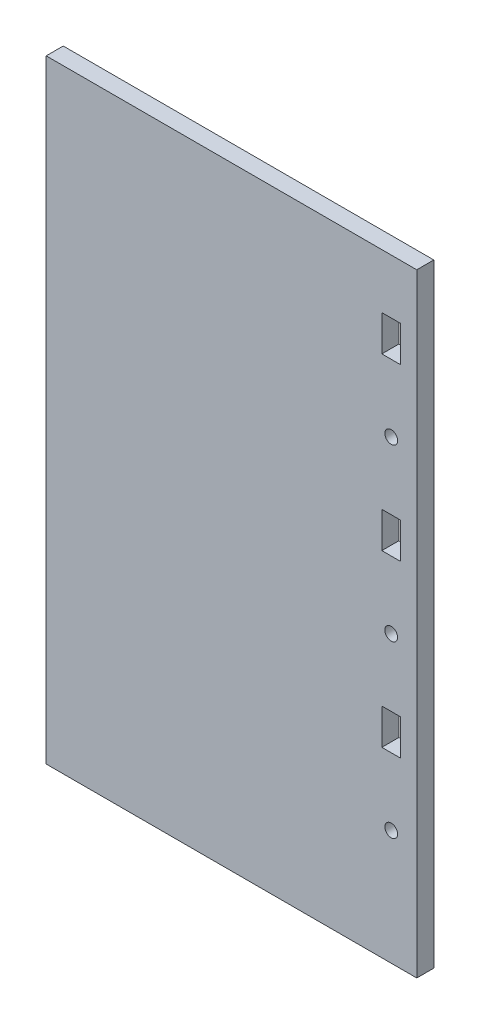
ISO-10303-21;
HEADER;
FILE_DESCRIPTION(('STEP AP214'),'2;1');
FILE_NAME('part.step','',(''),(''),'','','');
FILE_SCHEMA(('AUTOMOTIVE_DESIGN { 1 0 10303 214 1 1 1 1 }'));
ENDSEC;
DATA;
#1=APPLICATION_CONTEXT('core data for automotive mechanical design processes');
#2=APPLICATION_PROTOCOL_DEFINITION('international standard','automotive_design',2000,#1);
#3=PRODUCT_CONTEXT('',#1,'mechanical');
#4=PRODUCT('Part','Part','',(#3));
#5=PRODUCT_RELATED_PRODUCT_CATEGORY('part','',(#4));
#6=PRODUCT_DEFINITION_FORMATION('','',#4);
#7=PRODUCT_DEFINITION_CONTEXT('part definition',#1,'design');
#8=PRODUCT_DEFINITION('design','',#6,#7);
#9=PRODUCT_DEFINITION_SHAPE('','',#8);
#10=(LENGTH_UNIT() NAMED_UNIT(*) SI_UNIT(.MILLI.,.METRE.));
#11=(NAMED_UNIT(*) PLANE_ANGLE_UNIT() SI_UNIT($,.RADIAN.));
#12=(NAMED_UNIT(*) SI_UNIT($,.STERADIAN.) SOLID_ANGLE_UNIT());
#13=UNCERTAINTY_MEASURE_WITH_UNIT(LENGTH_MEASURE(1.E-05),#10,'distance_accuracy_value','');
#14=(GEOMETRIC_REPRESENTATION_CONTEXT(3) GLOBAL_UNCERTAINTY_ASSIGNED_CONTEXT((#13)) GLOBAL_UNIT_ASSIGNED_CONTEXT((#10,
#11,#12)) REPRESENTATION_CONTEXT('',''));
#15=CARTESIAN_POINT('',(0.,0.,0.));
#16=DIRECTION('',(0.,0.,1.));
#17=DIRECTION('',(1.,0.,0.));
#18=AXIS2_PLACEMENT_3D('',#15,#16,#17);
#19=CARTESIAN_POINT('',(0.,0.,4.));
#20=DIRECTION('',(0.,0.,-1.));
#21=DIRECTION('',(-1.,0.,0.));
#22=AXIS2_PLACEMENT_3D('',#19,#20,#21);
#23=PLANE('',#22);
#24=DIRECTION('',(1.,0.,0.));
#25=VECTOR('',#24,1.);
#26=CARTESIAN_POINT('',(35.3,-91.2,4.));
#27=LINE('',#26,#25);
#28=CARTESIAN_POINT('',(35.3,-91.2,4.));
#29=VERTEX_POINT('',#28);
#30=CARTESIAN_POINT('',(39.7,-91.2,4.));
#31=VERTEX_POINT('',#30);
#32=EDGE_CURVE('E237',#29,#31,#27,.T.);
#33=ORIENTED_EDGE('',*,*,#32,.F.);
#34=DIRECTION('',(0.,-1.,0.));
#35=VECTOR('',#34,1.);
#36=CARTESIAN_POINT('',(35.3,-91.2,4.));
#37=LINE('',#36,#35);
#38=CARTESIAN_POINT('',(35.3,-82.8,4.));
#39=VERTEX_POINT('',#38);
#40=EDGE_CURVE('E248',#39,#29,#37,.T.);
#41=ORIENTED_EDGE('',*,*,#40,.F.);
#42=DIRECTION('',(-1.,0.,0.));
#43=VECTOR('',#42,1.);
#44=CARTESIAN_POINT('',(35.3,-82.8,4.));
#45=LINE('',#44,#43);
#46=CARTESIAN_POINT('',(39.7,-82.8,4.));
#47=VERTEX_POINT('',#46);
#48=EDGE_CURVE('E244',#47,#39,#45,.T.);
#49=ORIENTED_EDGE('',*,*,#48,.F.);
#50=DIRECTION('',(0.,1.,0.));
#51=VECTOR('',#50,1.);
#52=CARTESIAN_POINT('',(39.7,-91.2,4.));
#53=LINE('',#52,#51);
#54=EDGE_CURVE('E240',#31,#47,#53,.T.);
#55=ORIENTED_EDGE('',*,*,#54,.F.);
#56=EDGE_LOOP('',(#33,#41,#49,#55));
#57=FACE_BOUND('',#56,.T.);
#58=CARTESIAN_POINT('',(37.5,-147.,4.));
#59=DIRECTION('',(0.,0.,1.));
#60=DIRECTION('',(1.,0.,0.));
#61=AXIS2_PLACEMENT_3D('',#58,#59,#60);
#62=CIRCLE('',#61,1.50000000000002);
#63=CARTESIAN_POINT('',(39.,-147.,4.));
#64=VERTEX_POINT('',#63);
#65=EDGE_CURVE('E331',#64,#64,#62,.T.);
#66=ORIENTED_EDGE('',*,*,#65,.F.);
#67=EDGE_LOOP('',(#66));
#68=FACE_BOUND('',#67,.T.);
#69=DIRECTION('',(0.,1.,0.));
#70=VECTOR('',#69,1.);
#71=CARTESIAN_POINT('',(43.5,-154.,4.));
#72=LINE('',#71,#70);
#73=CARTESIAN_POINT('',(43.5,-174.,4.));
#74=VERTEX_POINT('',#73);
#75=CARTESIAN_POINT('',(43.5,-30.,4.));
#76=VERTEX_POINT('',#75);
#77=EDGE_CURVE('E167',#74,#76,#72,.T.);
#78=ORIENTED_EDGE('',*,*,#77,.T.);
#79=DIRECTION('',(-1.,0.,0.));
#80=VECTOR('',#79,1.);
#81=CARTESIAN_POINT('',(-43.5,-30.,4.));
#82=LINE('',#81,#80);
#83=CARTESIAN_POINT('',(-43.5,-30.,4.));
#84=VERTEX_POINT('',#83);
#85=EDGE_CURVE('E340',#76,#84,#82,.T.);
#86=ORIENTED_EDGE('',*,*,#85,.T.);
#87=DIRECTION('',(0.,-1.,0.));
#88=VECTOR('',#87,1.);
#89=CARTESIAN_POINT('',(-43.5,-50.,4.));
#90=LINE('',#89,#88);
#91=CARTESIAN_POINT('',(-43.5,-174.,4.));
#92=VERTEX_POINT('',#91);
#93=EDGE_CURVE('E343',#84,#92,#90,.T.);
#94=ORIENTED_EDGE('',*,*,#93,.T.);
#95=DIRECTION('',(1.,0.,0.));
#96=VECTOR('',#95,1.);
#97=CARTESIAN_POINT('',(-43.5,-174.,4.));
#98=LINE('',#97,#96);
#99=EDGE_CURVE('E176',#92,#74,#98,.T.);
#100=ORIENTED_EDGE('',*,*,#99,.T.);
#101=EDGE_LOOP('',(#78,#86,#94,#100));
#102=FACE_BOUND('',#101,.T.);
#103=DIRECTION('',(0.,1.,0.));
#104=VECTOR('',#103,1.);
#105=CARTESIAN_POINT('',(39.7,-122.8,4.));
#106=LINE('',#105,#104);
#107=CARTESIAN_POINT('',(39.7,-131.2,4.));
#108=VERTEX_POINT('',#107);
#109=CARTESIAN_POINT('',(39.7,-122.8,4.));
#110=VERTEX_POINT('',#109);
#111=EDGE_CURVE('E288',#108,#110,#106,.T.);
#112=ORIENTED_EDGE('',*,*,#111,.F.);
#113=DIRECTION('',(1.,0.,0.));
#114=VECTOR('',#113,1.);
#115=CARTESIAN_POINT('',(35.3,-131.2,4.));
#116=LINE('',#115,#114);
#117=CARTESIAN_POINT('',(35.3,-131.2,4.));
#118=VERTEX_POINT('',#117);
#119=EDGE_CURVE('E299',#118,#108,#116,.T.);
#120=ORIENTED_EDGE('',*,*,#119,.F.);
#121=DIRECTION('',(0.,-1.,0.));
#122=VECTOR('',#121,1.);
#123=CARTESIAN_POINT('',(35.3,-122.8,4.));
#124=LINE('',#123,#122);
#125=CARTESIAN_POINT('',(35.3,-122.8,4.));
#126=VERTEX_POINT('',#125);
#127=EDGE_CURVE('E295',#126,#118,#124,.T.);
#128=ORIENTED_EDGE('',*,*,#127,.F.);
#129=DIRECTION('',(-1.,0.,0.));
#130=VECTOR('',#129,1.);
#131=CARTESIAN_POINT('',(35.3,-122.8,4.));
#132=LINE('',#131,#130);
#133=EDGE_CURVE('E291',#110,#126,#132,.T.);
#134=ORIENTED_EDGE('',*,*,#133,.F.);
#135=EDGE_LOOP('',(#112,#120,#128,#134));
#136=FACE_BOUND('',#135,.T.);
#137=CARTESIAN_POINT('',(37.5,-67.,4.));
#138=DIRECTION('',(0.,0.,1.));
#139=DIRECTION('',(1.,0.,0.));
#140=AXIS2_PLACEMENT_3D('',#137,#138,#139);
#141=CIRCLE('',#140,1.50000000000002);
#142=CARTESIAN_POINT('',(39.,-67.,4.));
#143=VERTEX_POINT('',#142);
#144=EDGE_CURVE('E280',#143,#143,#141,.T.);
#145=ORIENTED_EDGE('',*,*,#144,.F.);
#146=EDGE_LOOP('',(#145));
#147=FACE_BOUND('',#146,.T.);
#148=DIRECTION('',(0.,-1.,0.));
#149=VECTOR('',#148,1.);
#150=CARTESIAN_POINT('',(35.3,-42.8,4.));
#151=LINE('',#150,#149);
#152=CARTESIAN_POINT('',(35.3,-42.8,4.));
#153=VERTEX_POINT('',#152);
#154=CARTESIAN_POINT('',(35.3,-51.2,4.));
#155=VERTEX_POINT('',#154);
#156=EDGE_CURVE('E199',#153,#155,#151,.T.);
#157=ORIENTED_EDGE('',*,*,#156,.F.);
#158=DIRECTION('',(-1.,0.,0.));
#159=VECTOR('',#158,1.);
#160=CARTESIAN_POINT('',(35.3,-42.8,4.));
#161=LINE('',#160,#159);
#162=CARTESIAN_POINT('',(39.7,-42.8,4.));
#163=VERTEX_POINT('',#162);
#164=EDGE_CURVE('E209',#163,#153,#161,.T.);
#165=ORIENTED_EDGE('',*,*,#164,.F.);
#166=DIRECTION('',(0.,1.,0.));
#167=VECTOR('',#166,1.);
#168=CARTESIAN_POINT('',(39.7,-42.8,4.));
#169=LINE('',#168,#167);
#170=CARTESIAN_POINT('',(39.7,-51.1999999999999,4.));
#171=VERTEX_POINT('',#170);
#172=EDGE_CURVE('E206',#171,#163,#169,.T.);
#173=ORIENTED_EDGE('',*,*,#172,.F.);
#174=DIRECTION('',(1.,0.,0.));
#175=VECTOR('',#174,1.);
#176=CARTESIAN_POINT('',(35.3,-51.2,4.));
#177=LINE('',#176,#175);
#178=EDGE_CURVE('E202',#155,#171,#177,.T.);
#179=ORIENTED_EDGE('',*,*,#178,.F.);
#180=EDGE_LOOP('',(#157,#165,#173,#179));
#181=FACE_BOUND('',#180,.T.);
#182=CARTESIAN_POINT('',(37.5,-107.,4.));
#183=DIRECTION('',(0.,0.,1.));
#184=DIRECTION('',(1.,0.,0.));
#185=AXIS2_PLACEMENT_3D('',#182,#183,#184);
#186=CIRCLE('',#185,1.5);
#187=CARTESIAN_POINT('',(39.,-107.,4.));
#188=VERTEX_POINT('',#187);
#189=EDGE_CURVE('E192',#188,#188,#186,.T.);
#190=ORIENTED_EDGE('',*,*,#189,.F.);
#191=EDGE_LOOP('',(#190));
#192=FACE_BOUND('',#191,.T.);
#193=ADVANCED_FACE('F39',(#57,#68,#102,#136,#147,#181,#192),#23,.F.);
#194=CARTESIAN_POINT('',(0.,0.,0.));
#195=DIRECTION('',(0.,0.,-1.));
#196=DIRECTION('',(-1.,0.,0.));
#197=AXIS2_PLACEMENT_3D('',#194,#195,#196);
#198=PLANE('',#197);
#199=DIRECTION('',(-1.,0.,0.));
#200=VECTOR('',#199,1.);
#201=CARTESIAN_POINT('',(35.3,-42.8,0.));
#202=LINE('',#201,#200);
#203=CARTESIAN_POINT('',(39.7,-42.8,0.));
#204=VERTEX_POINT('',#203);
#205=CARTESIAN_POINT('',(35.3,-42.8,0.));
#206=VERTEX_POINT('',#205);
#207=EDGE_CURVE('E203',#204,#206,#202,.T.);
#208=ORIENTED_EDGE('',*,*,#207,.T.);
#209=DIRECTION('',(0.,-1.,0.));
#210=VECTOR('',#209,1.);
#211=CARTESIAN_POINT('',(35.3,-42.8,0.));
#212=LINE('',#211,#210);
#213=CARTESIAN_POINT('',(35.3,-51.2,0.));
#214=VERTEX_POINT('',#213);
#215=EDGE_CURVE('E63',#206,#214,#212,.T.);
#216=ORIENTED_EDGE('',*,*,#215,.T.);
#217=DIRECTION('',(1.,0.,0.));
#218=VECTOR('',#217,1.);
#219=CARTESIAN_POINT('',(35.3,-51.2,0.));
#220=LINE('',#219,#218);
#221=CARTESIAN_POINT('',(39.7,-51.1999999999999,0.));
#222=VERTEX_POINT('',#221);
#223=EDGE_CURVE('E215',#214,#222,#220,.T.);
#224=ORIENTED_EDGE('',*,*,#223,.T.);
#225=DIRECTION('',(0.,1.,0.));
#226=VECTOR('',#225,1.);
#227=CARTESIAN_POINT('',(39.7,-42.8,0.));
#228=LINE('',#227,#226);
#229=EDGE_CURVE('E219',#222,#204,#228,.T.);
#230=ORIENTED_EDGE('',*,*,#229,.T.);
#231=EDGE_LOOP('',(#208,#216,#224,#230));
#232=FACE_BOUND('',#231,.T.);
#233=DIRECTION('',(0.,-1.,0.));
#234=VECTOR('',#233,1.);
#235=CARTESIAN_POINT('',(35.3,-91.2,0.));
#236=LINE('',#235,#234);
#237=CARTESIAN_POINT('',(35.3,-82.8,0.));
#238=VERTEX_POINT('',#237);
#239=CARTESIAN_POINT('',(35.3,-91.2,0.));
#240=VERTEX_POINT('',#239);
#241=EDGE_CURVE('E241',#238,#240,#236,.T.);
#242=ORIENTED_EDGE('',*,*,#241,.T.);
#243=DIRECTION('',(1.,0.,0.));
#244=VECTOR('',#243,1.);
#245=CARTESIAN_POINT('',(35.3,-91.2,0.));
#246=LINE('',#245,#244);
#247=CARTESIAN_POINT('',(39.7,-91.2,0.));
#248=VERTEX_POINT('',#247);
#249=EDGE_CURVE('E236',#240,#248,#246,.T.);
#250=ORIENTED_EDGE('',*,*,#249,.T.);
#251=DIRECTION('',(0.,1.,0.));
#252=VECTOR('',#251,1.);
#253=CARTESIAN_POINT('',(39.7,-91.2,0.));
#254=LINE('',#253,#252);
#255=CARTESIAN_POINT('',(39.7,-82.8,0.));
#256=VERTEX_POINT('',#255);
#257=EDGE_CURVE('E255',#248,#256,#254,.T.);
#258=ORIENTED_EDGE('',*,*,#257,.T.);
#259=DIRECTION('',(-1.,0.,0.));
#260=VECTOR('',#259,1.);
#261=CARTESIAN_POINT('',(35.3,-82.8,0.));
#262=LINE('',#261,#260);
#263=EDGE_CURVE('E259',#256,#238,#262,.T.);
#264=ORIENTED_EDGE('',*,*,#263,.T.);
#265=EDGE_LOOP('',(#242,#250,#258,#264));
#266=FACE_BOUND('',#265,.T.);
#267=CARTESIAN_POINT('',(37.5,-67.,0.));
#268=DIRECTION('',(0.,0.,1.));
#269=DIRECTION('',(1.,0.,0.));
#270=AXIS2_PLACEMENT_3D('',#267,#268,#269);
#271=CIRCLE('',#270,1.50000000000002);
#272=CARTESIAN_POINT('',(39.,-67.,0.));
#273=VERTEX_POINT('',#272);
#274=EDGE_CURVE('E279',#273,#273,#271,.T.);
#275=ORIENTED_EDGE('',*,*,#274,.T.);
#276=EDGE_LOOP('',(#275));
#277=FACE_BOUND('',#276,.T.);
#278=DIRECTION('',(0.,1.,0.));
#279=VECTOR('',#278,1.);
#280=CARTESIAN_POINT('',(43.5,-30.,0.));
#281=LINE('',#280,#279);
#282=CARTESIAN_POINT('',(43.5,-174.,0.));
#283=VERTEX_POINT('',#282);
#284=CARTESIAN_POINT('',(43.5,-30.,0.));
#285=VERTEX_POINT('',#284);
#286=EDGE_CURVE('E182',#283,#285,#281,.T.);
#287=ORIENTED_EDGE('',*,*,#286,.F.);
#288=DIRECTION('',(1.,0.,0.));
#289=VECTOR('',#288,1.);
#290=CARTESIAN_POINT('',(-43.5,-174.,0.));
#291=LINE('',#290,#289);
#292=CARTESIAN_POINT('',(-43.5,-174.,0.));
#293=VERTEX_POINT('',#292);
#294=EDGE_CURVE('E174',#293,#283,#291,.T.);
#295=ORIENTED_EDGE('',*,*,#294,.F.);
#296=DIRECTION('',(0.,-1.,0.));
#297=VECTOR('',#296,1.);
#298=CARTESIAN_POINT('',(-43.5,-150.,0.));
#299=LINE('',#298,#297);
#300=CARTESIAN_POINT('',(-43.5,-30.,0.));
#301=VERTEX_POINT('',#300);
#302=EDGE_CURVE('E155',#301,#293,#299,.T.);
#303=ORIENTED_EDGE('',*,*,#302,.F.);
#304=DIRECTION('',(-1.,0.,0.));
#305=VECTOR('',#304,1.);
#306=CARTESIAN_POINT('',(-43.5,-30.,0.));
#307=LINE('',#306,#305);
#308=EDGE_CURVE('E168',#285,#301,#307,.T.);
#309=ORIENTED_EDGE('',*,*,#308,.F.);
#310=EDGE_LOOP('',(#287,#295,#303,#309));
#311=FACE_BOUND('',#310,.T.);
#312=CARTESIAN_POINT('',(37.5,-147.,0.));
#313=DIRECTION('',(0.,0.,1.));
#314=DIRECTION('',(1.,0.,0.));
#315=AXIS2_PLACEMENT_3D('',#312,#313,#314);
#316=CIRCLE('',#315,1.50000000000002);
#317=CARTESIAN_POINT('',(39.,-147.,0.));
#318=VERTEX_POINT('',#317);
#319=EDGE_CURVE('E330',#318,#318,#316,.T.);
#320=ORIENTED_EDGE('',*,*,#319,.T.);
#321=EDGE_LOOP('',(#320));
#322=FACE_BOUND('',#321,.T.);
#323=DIRECTION('',(1.,0.,0.));
#324=VECTOR('',#323,1.);
#325=CARTESIAN_POINT('',(35.3,-131.2,0.));
#326=LINE('',#325,#324);
#327=CARTESIAN_POINT('',(35.3,-131.2,0.));
#328=VERTEX_POINT('',#327);
#329=CARTESIAN_POINT('',(39.7,-131.2,0.));
#330=VERTEX_POINT('',#329);
#331=EDGE_CURVE('E292',#328,#330,#326,.T.);
#332=ORIENTED_EDGE('',*,*,#331,.T.);
#333=DIRECTION('',(0.,1.,0.));
#334=VECTOR('',#333,1.);
#335=CARTESIAN_POINT('',(39.7,-122.8,0.));
#336=LINE('',#335,#334);
#337=CARTESIAN_POINT('',(39.7,-122.8,0.));
#338=VERTEX_POINT('',#337);
#339=EDGE_CURVE('E284',#330,#338,#336,.T.);
#340=ORIENTED_EDGE('',*,*,#339,.T.);
#341=DIRECTION('',(-1.,0.,0.));
#342=VECTOR('',#341,1.);
#343=CARTESIAN_POINT('',(35.3,-122.8,0.));
#344=LINE('',#343,#342);
#345=CARTESIAN_POINT('',(35.3,-122.8,0.));
#346=VERTEX_POINT('',#345);
#347=EDGE_CURVE('E306',#338,#346,#344,.T.);
#348=ORIENTED_EDGE('',*,*,#347,.T.);
#349=DIRECTION('',(0.,-1.,0.));
#350=VECTOR('',#349,1.);
#351=CARTESIAN_POINT('',(35.3,-122.8,0.));
#352=LINE('',#351,#350);
#353=EDGE_CURVE('E310',#346,#328,#352,.T.);
#354=ORIENTED_EDGE('',*,*,#353,.T.);
#355=EDGE_LOOP('',(#332,#340,#348,#354));
#356=FACE_BOUND('',#355,.T.);
#357=CARTESIAN_POINT('',(37.5,-107.,0.));
#358=DIRECTION('',(0.,0.,1.));
#359=DIRECTION('',(1.,0.,0.));
#360=AXIS2_PLACEMENT_3D('',#357,#358,#359);
#361=CIRCLE('',#360,1.5);
#362=CARTESIAN_POINT('',(39.,-107.,0.));
#363=VERTEX_POINT('',#362);
#364=EDGE_CURVE('E190',#363,#363,#361,.T.);
#365=ORIENTED_EDGE('',*,*,#364,.T.);
#366=EDGE_LOOP('',(#365));
#367=FACE_BOUND('',#366,.T.);
#368=ADVANCED_FACE('F180',(#232,#266,#277,#311,#322,#356,#367),#198,.T.);
#369=CARTESIAN_POINT('',(43.5,-30.,4.));
#370=DIRECTION('',(-1.,0.,0.));
#371=DIRECTION('',(0.,0.,1.));
#372=AXIS2_PLACEMENT_3D('',#369,#370,#371);
#373=PLANE('',#372);
#374=ORIENTED_EDGE('',*,*,#286,.T.);
#375=DIRECTION('',(0.,0.,-1.));
#376=VECTOR('',#375,1.);
#377=CARTESIAN_POINT('',(43.5,-30.,4.));
#378=LINE('',#377,#376);
#379=EDGE_CURVE('E11',#76,#285,#378,.T.);
#380=ORIENTED_EDGE('',*,*,#379,.F.);
#381=ORIENTED_EDGE('',*,*,#77,.F.);
#382=DIRECTION('',(0.,0.,1.));
#383=VECTOR('',#382,1.);
#384=CARTESIAN_POINT('',(43.5,-174.,0.));
#385=LINE('',#384,#383);
#386=EDGE_CURVE('E178',#283,#74,#385,.T.);
#387=ORIENTED_EDGE('',*,*,#386,.F.);
#388=EDGE_LOOP('',(#374,#380,#381,#387));
#389=FACE_BOUND('',#388,.T.);
#390=ADVANCED_FACE('F41',(#389),#373,.F.);
#391=CARTESIAN_POINT('',(-43.5,-30.,4.));
#392=DIRECTION('',(0.,-1.,0.));
#393=DIRECTION('',(0.,0.,-1.));
#394=AXIS2_PLACEMENT_3D('',#391,#392,#393);
#395=PLANE('',#394);
#396=ORIENTED_EDGE('',*,*,#308,.T.);
#397=DIRECTION('',(0.,0.,-1.));
#398=VECTOR('',#397,1.);
#399=CARTESIAN_POINT('',(-43.5,-30.,4.));
#400=LINE('',#399,#398);
#401=EDGE_CURVE('E48',#84,#301,#400,.T.);
#402=ORIENTED_EDGE('',*,*,#401,.F.);
#403=ORIENTED_EDGE('',*,*,#85,.F.);
#404=ORIENTED_EDGE('',*,*,#379,.T.);
#405=EDGE_LOOP('',(#396,#402,#403,#404));
#406=FACE_BOUND('',#405,.T.);
#407=ADVANCED_FACE('F351',(#406),#395,.F.);
#408=CARTESIAN_POINT('',(-43.5,-150.,4.));
#409=DIRECTION('',(1.,0.,0.));
#410=DIRECTION('',(0.,0.,-1.));
#411=AXIS2_PLACEMENT_3D('',#408,#409,#410);
#412=PLANE('',#411);
#413=ORIENTED_EDGE('',*,*,#302,.T.);
#414=DIRECTION('',(0.,0.,1.));
#415=VECTOR('',#414,1.);
#416=CARTESIAN_POINT('',(-43.5,-174.,0.));
#417=LINE('',#416,#415);
#418=EDGE_CURVE('E159',#293,#92,#417,.T.);
#419=ORIENTED_EDGE('',*,*,#418,.T.);
#420=ORIENTED_EDGE('',*,*,#93,.F.);
#421=ORIENTED_EDGE('',*,*,#401,.T.);
#422=EDGE_LOOP('',(#413,#419,#420,#421));
#423=FACE_BOUND('',#422,.T.);
#424=ADVANCED_FACE('F157',(#423),#412,.F.);
#425=CARTESIAN_POINT('',(37.5,-147.,4.));
#426=DIRECTION('',(0.,0.,-1.));
#427=DIRECTION('',(-1.,0.,0.));
#428=AXIS2_PLACEMENT_3D('',#425,#426,#427);
#429=CYLINDRICAL_SURFACE('',#428,1.50000000000002);
#430=ORIENTED_EDGE('',*,*,#65,.T.);
#431=EDGE_LOOP('',(#430));
#432=FACE_BOUND('',#431,.T.);
#433=ORIENTED_EDGE('',*,*,#319,.F.);
#434=EDGE_LOOP('',(#433));
#435=FACE_BOUND('',#434,.T.);
#436=ADVANCED_FACE('F389',(#432,#435),#429,.F.);
#437=CARTESIAN_POINT('',(39.7,-122.8,4.));
#438=DIRECTION('',(-1.,0.,0.));
#439=DIRECTION('',(0.,0.,1.));
#440=AXIS2_PLACEMENT_3D('',#437,#438,#439);
#441=PLANE('',#440);
#442=ORIENTED_EDGE('',*,*,#339,.F.);
#443=DIRECTION('',(0.,0.,-1.));
#444=VECTOR('',#443,1.);
#445=CARTESIAN_POINT('',(39.7,-131.2,4.));
#446=LINE('',#445,#444);
#447=EDGE_CURVE('E302',#108,#330,#446,.T.);
#448=ORIENTED_EDGE('',*,*,#447,.F.);
#449=ORIENTED_EDGE('',*,*,#111,.T.);
#450=DIRECTION('',(0.,0.,-1.));
#451=VECTOR('',#450,1.);
#452=CARTESIAN_POINT('',(39.7,-122.8,4.));
#453=LINE('',#452,#451);
#454=EDGE_CURVE('E326',#110,#338,#453,.T.);
#455=ORIENTED_EDGE('',*,*,#454,.T.);
#456=EDGE_LOOP('',(#442,#448,#449,#455));
#457=FACE_BOUND('',#456,.T.);
#458=ADVANCED_FACE('F406',(#457),#441,.T.);
#459=CARTESIAN_POINT('',(35.3,-122.8,4.));
#460=DIRECTION('',(0.,-1.,0.));
#461=DIRECTION('',(0.,0.,-1.));
#462=AXIS2_PLACEMENT_3D('',#459,#460,#461);
#463=PLANE('',#462);
#464=ORIENTED_EDGE('',*,*,#347,.F.);
#465=ORIENTED_EDGE('',*,*,#454,.F.);
#466=ORIENTED_EDGE('',*,*,#133,.T.);
#467=DIRECTION('',(0.,0.,-1.));
#468=VECTOR('',#467,1.);
#469=CARTESIAN_POINT('',(35.3,-122.8,4.));
#470=LINE('',#469,#468);
#471=EDGE_CURVE('E323',#126,#346,#470,.T.);
#472=ORIENTED_EDGE('',*,*,#471,.T.);
#473=EDGE_LOOP('',(#464,#465,#466,#472));
#474=FACE_BOUND('',#473,.T.);
#475=ADVANCED_FACE('F413',(#474),#463,.T.);
#476=CARTESIAN_POINT('',(35.3,-122.8,4.));
#477=DIRECTION('',(1.,0.,0.));
#478=DIRECTION('',(0.,0.,-1.));
#479=AXIS2_PLACEMENT_3D('',#476,#477,#478);
#480=PLANE('',#479);
#481=ORIENTED_EDGE('',*,*,#353,.F.);
#482=ORIENTED_EDGE('',*,*,#471,.F.);
#483=ORIENTED_EDGE('',*,*,#127,.T.);
#484=DIRECTION('',(0.,0.,-1.));
#485=VECTOR('',#484,1.);
#486=CARTESIAN_POINT('',(35.3,-131.2,4.));
#487=LINE('',#486,#485);
#488=EDGE_CURVE('E320',#118,#328,#487,.T.);
#489=ORIENTED_EDGE('',*,*,#488,.T.);
#490=EDGE_LOOP('',(#481,#482,#483,#489));
#491=FACE_BOUND('',#490,.T.);
#492=ADVANCED_FACE('F421',(#491),#480,.T.);
#493=CARTESIAN_POINT('',(35.3,-131.2,4.));
#494=DIRECTION('',(0.,1.,0.));
#495=DIRECTION('',(0.,0.,1.));
#496=AXIS2_PLACEMENT_3D('',#493,#494,#495);
#497=PLANE('',#496);
#498=ORIENTED_EDGE('',*,*,#331,.F.);
#499=ORIENTED_EDGE('',*,*,#488,.F.);
#500=ORIENTED_EDGE('',*,*,#119,.T.);
#501=ORIENTED_EDGE('',*,*,#447,.T.);
#502=EDGE_LOOP('',(#498,#499,#500,#501));
#503=FACE_BOUND('',#502,.T.);
#504=ADVANCED_FACE('F429',(#503),#497,.T.);
#505=CARTESIAN_POINT('',(37.5,-67.,4.));
#506=DIRECTION('',(0.,0.,-1.));
#507=DIRECTION('',(-1.,0.,0.));
#508=AXIS2_PLACEMENT_3D('',#505,#506,#507);
#509=CYLINDRICAL_SURFACE('',#508,1.50000000000002);
#510=ORIENTED_EDGE('',*,*,#144,.T.);
#511=EDGE_LOOP('',(#510));
#512=FACE_BOUND('',#511,.T.);
#513=ORIENTED_EDGE('',*,*,#274,.F.);
#514=EDGE_LOOP('',(#513));
#515=FACE_BOUND('',#514,.T.);
#516=ADVANCED_FACE('F437',(#512,#515),#509,.F.);
#517=CARTESIAN_POINT('',(35.3,-91.2,4.));
#518=DIRECTION('',(0.,1.,0.));
#519=DIRECTION('',(0.,0.,1.));
#520=AXIS2_PLACEMENT_3D('',#517,#518,#519);
#521=PLANE('',#520);
#522=ORIENTED_EDGE('',*,*,#249,.F.);
#523=DIRECTION('',(0.,0.,-1.));
#524=VECTOR('',#523,1.);
#525=CARTESIAN_POINT('',(35.3,-91.2,4.));
#526=LINE('',#525,#524);
#527=EDGE_CURVE('E251',#29,#240,#526,.T.);
#528=ORIENTED_EDGE('',*,*,#527,.F.);
#529=ORIENTED_EDGE('',*,*,#32,.T.);
#530=DIRECTION('',(0.,0.,-1.));
#531=VECTOR('',#530,1.);
#532=CARTESIAN_POINT('',(39.7,-91.2,4.));
#533=LINE('',#532,#531);
#534=EDGE_CURVE('E275',#31,#248,#533,.T.);
#535=ORIENTED_EDGE('',*,*,#534,.T.);
#536=EDGE_LOOP('',(#522,#528,#529,#535));
#537=FACE_BOUND('',#536,.T.);
#538=ADVANCED_FACE('F445',(#537),#521,.T.);
#539=CARTESIAN_POINT('',(39.7,-91.2,4.));
#540=DIRECTION('',(-1.,0.,0.));
#541=DIRECTION('',(0.,0.,1.));
#542=AXIS2_PLACEMENT_3D('',#539,#540,#541);
#543=PLANE('',#542);
#544=ORIENTED_EDGE('',*,*,#257,.F.);
#545=ORIENTED_EDGE('',*,*,#534,.F.);
#546=ORIENTED_EDGE('',*,*,#54,.T.);
#547=DIRECTION('',(0.,0.,-1.));
#548=VECTOR('',#547,1.);
#549=CARTESIAN_POINT('',(39.7,-82.8,4.));
#550=LINE('',#549,#548);
#551=EDGE_CURVE('E272',#47,#256,#550,.T.);
#552=ORIENTED_EDGE('',*,*,#551,.T.);
#553=EDGE_LOOP('',(#544,#545,#546,#552));
#554=FACE_BOUND('',#553,.T.);
#555=ADVANCED_FACE('F453',(#554),#543,.T.);
#556=CARTESIAN_POINT('',(35.3,-82.8,4.));
#557=DIRECTION('',(0.,-1.,0.));
#558=DIRECTION('',(0.,0.,-1.));
#559=AXIS2_PLACEMENT_3D('',#556,#557,#558);
#560=PLANE('',#559);
#561=ORIENTED_EDGE('',*,*,#263,.F.);
#562=ORIENTED_EDGE('',*,*,#551,.F.);
#563=ORIENTED_EDGE('',*,*,#48,.T.);
#564=DIRECTION('',(0.,0.,-1.));
#565=VECTOR('',#564,1.);
#566=CARTESIAN_POINT('',(35.3,-82.8,4.));
#567=LINE('',#566,#565);
#568=EDGE_CURVE('E269',#39,#238,#567,.T.);
#569=ORIENTED_EDGE('',*,*,#568,.T.);
#570=EDGE_LOOP('',(#561,#562,#563,#569));
#571=FACE_BOUND('',#570,.T.);
#572=ADVANCED_FACE('F461',(#571),#560,.T.);
#573=CARTESIAN_POINT('',(35.3,-91.2,4.));
#574=DIRECTION('',(1.,0.,0.));
#575=DIRECTION('',(0.,0.,-1.));
#576=AXIS2_PLACEMENT_3D('',#573,#574,#575);
#577=PLANE('',#576);
#578=ORIENTED_EDGE('',*,*,#241,.F.);
#579=ORIENTED_EDGE('',*,*,#568,.F.);
#580=ORIENTED_EDGE('',*,*,#40,.T.);
#581=ORIENTED_EDGE('',*,*,#527,.T.);
#582=EDGE_LOOP('',(#578,#579,#580,#581));
#583=FACE_BOUND('',#582,.T.);
#584=ADVANCED_FACE('F469',(#583),#577,.T.);
#585=CARTESIAN_POINT('',(35.3,-42.8,4.));
#586=DIRECTION('',(1.,0.,0.));
#587=DIRECTION('',(0.,0.,-1.));
#588=AXIS2_PLACEMENT_3D('',#585,#586,#587);
#589=PLANE('',#588);
#590=ORIENTED_EDGE('',*,*,#215,.F.);
#591=DIRECTION('',(0.,0.,-1.));
#592=VECTOR('',#591,1.);
#593=CARTESIAN_POINT('',(35.3,-42.8,4.));
#594=LINE('',#593,#592);
#595=EDGE_CURVE('E212',#153,#206,#594,.T.);
#596=ORIENTED_EDGE('',*,*,#595,.F.);
#597=ORIENTED_EDGE('',*,*,#156,.T.);
#598=DIRECTION('',(0.,0.,-1.));
#599=VECTOR('',#598,1.);
#600=CARTESIAN_POINT('',(35.3,-51.2,4.));
#601=LINE('',#600,#599);
#602=EDGE_CURVE('E233',#155,#214,#601,.T.);
#603=ORIENTED_EDGE('',*,*,#602,.T.);
#604=EDGE_LOOP('',(#590,#596,#597,#603));
#605=FACE_BOUND('',#604,.T.);
#606=ADVANCED_FACE('F477',(#605),#589,.T.);
#607=CARTESIAN_POINT('',(35.3,-51.2,4.));
#608=DIRECTION('',(0.,1.,0.));
#609=DIRECTION('',(-1.,0.,0.));
#610=AXIS2_PLACEMENT_3D('',#607,#608,#609);
#611=PLANE('',#610);
#612=ORIENTED_EDGE('',*,*,#223,.F.);
#613=ORIENTED_EDGE('',*,*,#602,.F.);
#614=ORIENTED_EDGE('',*,*,#178,.T.);
#615=DIRECTION('',(0.,0.,-1.));
#616=VECTOR('',#615,1.);
#617=CARTESIAN_POINT('',(39.7,-51.1999999999999,4.));
#618=LINE('',#617,#616);
#619=EDGE_CURVE('E230',#171,#222,#618,.T.);
#620=ORIENTED_EDGE('',*,*,#619,.T.);
#621=EDGE_LOOP('',(#612,#613,#614,#620));
#622=FACE_BOUND('',#621,.T.);
#623=ADVANCED_FACE('F485',(#622),#611,.T.);
#624=CARTESIAN_POINT('',(39.7,-42.8,4.));
#625=DIRECTION('',(-1.,0.,0.));
#626=DIRECTION('',(0.,0.,1.));
#627=AXIS2_PLACEMENT_3D('',#624,#625,#626);
#628=PLANE('',#627);
#629=ORIENTED_EDGE('',*,*,#229,.F.);
#630=ORIENTED_EDGE('',*,*,#619,.F.);
#631=ORIENTED_EDGE('',*,*,#172,.T.);
#632=DIRECTION('',(0.,0.,-1.));
#633=VECTOR('',#632,1.);
#634=CARTESIAN_POINT('',(39.7,-42.8,4.));
#635=LINE('',#634,#633);
#636=EDGE_CURVE('E55',#163,#204,#635,.T.);
#637=ORIENTED_EDGE('',*,*,#636,.T.);
#638=EDGE_LOOP('',(#629,#630,#631,#637));
#639=FACE_BOUND('',#638,.T.);
#640=ADVANCED_FACE('F492',(#639),#628,.T.);
#641=CARTESIAN_POINT('',(35.3,-42.8,4.));
#642=DIRECTION('',(0.,-1.,0.));
#643=DIRECTION('',(0.,0.,-1.));
#644=AXIS2_PLACEMENT_3D('',#641,#642,#643);
#645=PLANE('',#644);
#646=ORIENTED_EDGE('',*,*,#207,.F.);
#647=ORIENTED_EDGE('',*,*,#636,.F.);
#648=ORIENTED_EDGE('',*,*,#164,.T.);
#649=ORIENTED_EDGE('',*,*,#595,.T.);
#650=EDGE_LOOP('',(#646,#647,#648,#649));
#651=FACE_BOUND('',#650,.T.);
#652=ADVANCED_FACE('F375',(#651),#645,.T.);
#653=CARTESIAN_POINT('',(37.5,-107.,4.));
#654=DIRECTION('',(0.,0.,-1.));
#655=DIRECTION('',(-1.,0.,0.));
#656=AXIS2_PLACEMENT_3D('',#653,#654,#655);
#657=CYLINDRICAL_SURFACE('',#656,1.5);
#658=ORIENTED_EDGE('',*,*,#189,.T.);
#659=EDGE_LOOP('',(#658));
#660=FACE_BOUND('',#659,.T.);
#661=ORIENTED_EDGE('',*,*,#364,.F.);
#662=EDGE_LOOP('',(#661));
#663=FACE_BOUND('',#662,.T.);
#664=ADVANCED_FACE('F372',(#660,#663),#657,.F.);
#665=CARTESIAN_POINT('',(-43.5,-174.,0.));
#666=DIRECTION('',(0.,-1.,0.));
#667=DIRECTION('',(0.,0.,-1.));
#668=AXIS2_PLACEMENT_3D('',#665,#666,#667);
#669=PLANE('',#668);
#670=ORIENTED_EDGE('',*,*,#99,.F.);
#671=ORIENTED_EDGE('',*,*,#418,.F.);
#672=ORIENTED_EDGE('',*,*,#294,.T.);
#673=ORIENTED_EDGE('',*,*,#386,.T.);
#674=EDGE_LOOP('',(#670,#671,#672,#673));
#675=FACE_BOUND('',#674,.T.);
#676=ADVANCED_FACE('F172',(#675),#669,.T.);
#677=CLOSED_SHELL('',(#193,#368,#390,#407,#424,#436,#458,#475,#492,#504,#516,#538,#555,#572,
#584,#606,#623,#640,#652,#664,#676));
#678=MANIFOLD_SOLID_BREP('B2',#677);
#679=ADVANCED_BREP_SHAPE_REPRESENTATION('',(#18,#678),#14);
#680=SHAPE_DEFINITION_REPRESENTATION(#9,#679);
ENDSEC;
END-ISO-10303-21;
